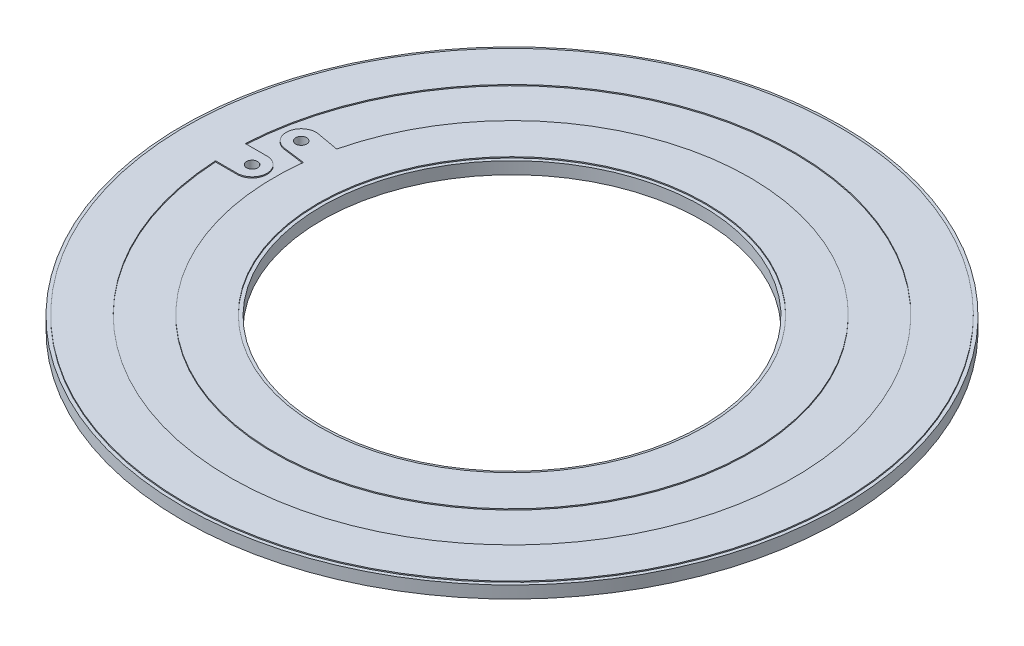
ISO-10303-21;
HEADER;
FILE_DESCRIPTION(('STEP AP214'),'2;1');
FILE_NAME('part.step','',(''),(''),'','','');
FILE_SCHEMA(('AUTOMOTIVE_DESIGN { 1 0 10303 214 1 1 1 1 }'));
ENDSEC;
DATA;
#1=APPLICATION_CONTEXT('core data for automotive mechanical design processes');
#2=APPLICATION_PROTOCOL_DEFINITION('international standard','automotive_design',2000,#1);
#3=PRODUCT_CONTEXT('',#1,'mechanical');
#4=PRODUCT('Part','Part','',(#3));
#5=PRODUCT_RELATED_PRODUCT_CATEGORY('part','',(#4));
#6=PRODUCT_DEFINITION_FORMATION('','',#4);
#7=PRODUCT_DEFINITION_CONTEXT('part definition',#1,'design');
#8=PRODUCT_DEFINITION('design','',#6,#7);
#9=PRODUCT_DEFINITION_SHAPE('','',#8);
#10=(LENGTH_UNIT() NAMED_UNIT(*) SI_UNIT(.MILLI.,.METRE.));
#11=(NAMED_UNIT(*) PLANE_ANGLE_UNIT() SI_UNIT($,.RADIAN.));
#12=(NAMED_UNIT(*) SI_UNIT($,.STERADIAN.) SOLID_ANGLE_UNIT());
#13=UNCERTAINTY_MEASURE_WITH_UNIT(LENGTH_MEASURE(1.E-05),#10,'distance_accuracy_value','');
#14=(GEOMETRIC_REPRESENTATION_CONTEXT(3) GLOBAL_UNCERTAINTY_ASSIGNED_CONTEXT((#13)) GLOBAL_UNIT_ASSIGNED_CONTEXT((#10,
#11,#12)) REPRESENTATION_CONTEXT('',''));
#15=CARTESIAN_POINT('',(0.,0.,0.));
#16=DIRECTION('',(0.,0.,1.));
#17=DIRECTION('',(1.,0.,0.));
#18=AXIS2_PLACEMENT_3D('',#15,#16,#17);
#19=CARTESIAN_POINT('',(0.,1.1,0.));
#20=DIRECTION('',(0.,1.,0.));
#21=DIRECTION('',(0.,0.,1.));
#22=AXIS2_PLACEMENT_3D('',#19,#20,#21);
#23=PLANE('',#22);
#24=CARTESIAN_POINT('',(0.,1.1,0.));
#25=DIRECTION('',(0.,1.,0.));
#26=DIRECTION('',(0.,0.,1.));
#27=AXIS2_PLACEMENT_3D('',#24,#25,#26);
#28=CIRCLE('',#27,25.5);
#29=CARTESIAN_POINT('',(-25.4644541235623,1.1,-1.34594806325903));
#30=VERTEX_POINT('',#29);
#31=CARTESIAN_POINT('',(-25.4644541235623,1.1,1.34594806325904));
#32=VERTEX_POINT('',#31);
#33=EDGE_CURVE('E12',#30,#32,#28,.F.);
#34=ORIENTED_EDGE('',*,*,#33,.F.);
#35=DIRECTION('',(-1.,0.,0.));
#36=VECTOR('',#35,1.);
#37=CARTESIAN_POINT('',(-23.5,1.1,-1.34594806325903));
#38=LINE('',#37,#36);
#39=CARTESIAN_POINT('',(-23.5,1.1,-1.34594806325903));
#40=VERTEX_POINT('',#39);
#41=EDGE_CURVE('E131',#40,#30,#38,.T.);
#42=ORIENTED_EDGE('',*,*,#41,.F.);
#43=CARTESIAN_POINT('',(-23.5,1.1,0.));
#44=DIRECTION('',(0.,1.,0.));
#45=DIRECTION('',(0.,0.,1.));
#46=AXIS2_PLACEMENT_3D('',#43,#44,#45);
#47=CIRCLE('',#46,1.34594806325904);
#48=CARTESIAN_POINT('',(-23.5,1.1,1.34594806325904));
#49=VERTEX_POINT('',#48);
#50=EDGE_CURVE('E147',#49,#40,#47,.T.);
#51=ORIENTED_EDGE('',*,*,#50,.F.);
#52=DIRECTION('',(1.,0.,0.));
#53=VECTOR('',#52,1.);
#54=CARTESIAN_POINT('',(-23.5,1.1,1.34594806325904));
#55=LINE('',#54,#53);
#56=EDGE_CURVE('E231',#32,#49,#55,.T.);
#57=ORIENTED_EDGE('',*,*,#56,.F.);
#58=EDGE_LOOP('',(#34,#42,#51,#57));
#59=FACE_BOUND('',#58,.T.);
#60=CARTESIAN_POINT('',(0.,1.1,0.));
#61=DIRECTION('',(0.,1.,0.));
#62=DIRECTION('',(0.,0.,1.));
#63=AXIS2_PLACEMENT_3D('',#60,#61,#62);
#64=CIRCLE('',#63,21.5);
#65=CARTESIAN_POINT('',(-21.3552893379837,1.1,-2.49030465826969));
#66=VERTEX_POINT('',#65);
#67=CARTESIAN_POINT('',(-20.8991983463195,1.1,-5.04712873634065));
#68=VERTEX_POINT('',#67);
#69=EDGE_CURVE('E163',#66,#68,#64,.T.);
#70=ORIENTED_EDGE('',*,*,#69,.F.);
#71=DIRECTION('',(0.991542013932121,0.,0.129786110995874));
#72=VECTOR('',#71,1.);
#73=CARTESIAN_POINT('',(-23.2663600421103,1.1,-2.74045082559459));
#74=LINE('',#73,#72);
#75=CARTESIAN_POINT('',(-23.2663600421103,1.1,-2.74045082559459));
#76=VERTEX_POINT('',#75);
#77=EDGE_CURVE('E220',#76,#66,#74,.T.);
#78=ORIENTED_EDGE('',*,*,#77,.F.);
#79=CARTESIAN_POINT('',(-23.1429821957869,1.1,-4.08073217517287));
#80=DIRECTION('',(0.,1.,0.));
#81=DIRECTION('',(-0.173648177666931,0.,0.984807753012208));
#82=AXIS2_PLACEMENT_3D('',#79,#80,#81);
#83=CIRCLE('',#82,1.34594806325904);
#84=CARTESIAN_POINT('',(-22.8005162282659,1.1,-5.38238237783128));
#85=VERTEX_POINT('',#84);
#86=EDGE_CURVE('E130',#85,#76,#83,.T.);
#87=ORIENTED_EDGE('',*,*,#86,.F.);
#88=DIRECTION('',(-0.984807753012208,0.,-0.17364817766693));
#89=VECTOR('',#88,1.);
#90=CARTESIAN_POINT('',(-22.8005162282659,1.1,-5.38238237783128));
#91=LINE('',#90,#89);
#92=EDGE_CURVE('E122',#68,#85,#91,.T.);
#93=ORIENTED_EDGE('',*,*,#92,.F.);
#94=EDGE_LOOP('',(#70,#78,#87,#93));
#95=FACE_BOUND('',#94,.T.);
#96=ADVANCED_FACE('F46',(#59,#95),#23,.T.);
#97=CARTESIAN_POINT('',(0.,1.2,0.));
#98=DIRECTION('',(0.,-1.,0.));
#99=DIRECTION('',(0.,0.,-1.));
#100=AXIS2_PLACEMENT_3D('',#97,#98,#99);
#101=CYLINDRICAL_SURFACE('',#100,21.5);
#102=DIRECTION('',(0.,-1.,0.));
#103=VECTOR('',#102,1.);
#104=CARTESIAN_POINT('',(-21.3552893379837,1.2,-2.49030465826969));
#105=LINE('',#104,#103);
#106=CARTESIAN_POINT('',(-21.3552893379837,1.2,-2.49030465826969));
#107=VERTEX_POINT('',#106);
#108=EDGE_CURVE('E116',#107,#66,#105,.T.);
#109=ORIENTED_EDGE('',*,*,#108,.T.);
#110=ORIENTED_EDGE('',*,*,#69,.T.);
#111=DIRECTION('',(0.,-1.,0.));
#112=VECTOR('',#111,1.);
#113=CARTESIAN_POINT('',(-20.8991983463195,1.2,-5.04712873634065));
#114=LINE('',#113,#112);
#115=CARTESIAN_POINT('',(-20.8991983463195,1.2,-5.04712873634065));
#116=VERTEX_POINT('',#115);
#117=EDGE_CURVE('E222',#116,#68,#114,.T.);
#118=ORIENTED_EDGE('',*,*,#117,.F.);
#119=CARTESIAN_POINT('',(0.,1.2,0.));
#120=DIRECTION('',(0.,1.,0.));
#121=DIRECTION('',(0.,0.,1.));
#122=AXIS2_PLACEMENT_3D('',#119,#120,#121);
#123=CIRCLE('',#122,21.5);
#124=EDGE_CURVE('E169',#107,#116,#123,.T.);
#125=ORIENTED_EDGE('',*,*,#124,.F.);
#126=EDGE_LOOP('',(#109,#110,#118,#125));
#127=FACE_BOUND('',#126,.T.);
#128=ADVANCED_FACE('F207',(#127),#101,.T.);
#129=CARTESIAN_POINT('',(-23.1429821957869,1.2,-4.08073217517287));
#130=DIRECTION('',(0.,-1.,0.));
#131=DIRECTION('',(0.,0.,-1.));
#132=AXIS2_PLACEMENT_3D('',#129,#130,#131);
#133=CYLINDRICAL_SURFACE('',#132,1.34594806325904);
#134=DIRECTION('',(0.,-1.,0.));
#135=VECTOR('',#134,1.);
#136=CARTESIAN_POINT('',(-23.2663600421103,1.2,-2.74045082559459));
#137=LINE('',#136,#135);
#138=CARTESIAN_POINT('',(-23.2663600421103,1.2,-2.74045082559459));
#139=VERTEX_POINT('',#138);
#140=EDGE_CURVE('E113',#139,#76,#137,.T.);
#141=ORIENTED_EDGE('',*,*,#140,.F.);
#142=CARTESIAN_POINT('',(-23.1429821957869,1.2,-4.08073217517287));
#143=DIRECTION('',(0.,1.,0.));
#144=DIRECTION('',(-0.173648177666931,0.,0.984807753012208));
#145=AXIS2_PLACEMENT_3D('',#142,#143,#144);
#146=CIRCLE('',#145,1.34594806325904);
#147=CARTESIAN_POINT('',(-22.8005162282659,1.2,-5.38238237783128));
#148=VERTEX_POINT('',#147);
#149=EDGE_CURVE('E128',#148,#139,#146,.T.);
#150=ORIENTED_EDGE('',*,*,#149,.F.);
#151=DIRECTION('',(0.,-1.,0.));
#152=VECTOR('',#151,1.);
#153=CARTESIAN_POINT('',(-22.8005162282659,1.2,-5.38238237783128));
#154=LINE('',#153,#152);
#155=EDGE_CURVE('E61',#148,#85,#154,.T.);
#156=ORIENTED_EDGE('',*,*,#155,.T.);
#157=ORIENTED_EDGE('',*,*,#86,.T.);
#158=EDGE_LOOP('',(#141,#150,#156,#157));
#159=FACE_BOUND('',#158,.T.);
#160=ADVANCED_FACE('F127',(#159),#133,.T.);
#161=CARTESIAN_POINT('',(0.,1.2,0.));
#162=DIRECTION('',(0.,-1.,0.));
#163=DIRECTION('',(0.,0.,-1.));
#164=AXIS2_PLACEMENT_3D('',#161,#162,#163);
#165=CYLINDRICAL_SURFACE('',#164,25.5);
#166=CARTESIAN_POINT('',(0.,1.2,0.));
#167=DIRECTION('',(0.,1.,0.));
#168=DIRECTION('',(0.,0.,1.));
#169=AXIS2_PLACEMENT_3D('',#166,#167,#168);
#170=CIRCLE('',#169,25.5);
#171=CARTESIAN_POINT('',(-25.4644541235623,1.2,1.34594806325904));
#172=VERTEX_POINT('',#171);
#173=CARTESIAN_POINT('',(-25.4644541235623,1.2,-1.34594806325903));
#174=VERTEX_POINT('',#173);
#175=EDGE_CURVE('E157',#172,#174,#170,.T.);
#176=ORIENTED_EDGE('',*,*,#175,.T.);
#177=DIRECTION('',(0.,-1.,0.));
#178=VECTOR('',#177,1.);
#179=CARTESIAN_POINT('',(-25.4644541235623,1.2,-1.34594806325903));
#180=LINE('',#179,#178);
#181=EDGE_CURVE('E240',#174,#30,#180,.T.);
#182=ORIENTED_EDGE('',*,*,#181,.T.);
#183=ORIENTED_EDGE('',*,*,#33,.T.);
#184=DIRECTION('',(0.,-1.,0.));
#185=VECTOR('',#184,1.);
#186=CARTESIAN_POINT('',(-25.4644541235623,1.2,1.34594806325904));
#187=LINE('',#186,#185);
#188=EDGE_CURVE('E238',#32,#172,#187,.F.);
#189=ORIENTED_EDGE('',*,*,#188,.T.);
#190=EDGE_LOOP('',(#176,#182,#183,#189));
#191=FACE_BOUND('',#190,.T.);
#192=ADVANCED_FACE('F201',(#191),#165,.F.);
#193=CARTESIAN_POINT('',(-23.5,1.2,0.));
#194=DIRECTION('',(0.,-1.,0.));
#195=DIRECTION('',(0.,0.,-1.));
#196=AXIS2_PLACEMENT_3D('',#193,#194,#195);
#197=CYLINDRICAL_SURFACE('',#196,1.34594806325904);
#198=DIRECTION('',(0.,-1.,0.));
#199=VECTOR('',#198,1.);
#200=CARTESIAN_POINT('',(-23.5,1.2,-1.34594806325903));
#201=LINE('',#200,#199);
#202=CARTESIAN_POINT('',(-23.5,1.2,-1.34594806325903));
#203=VERTEX_POINT('',#202);
#204=EDGE_CURVE('E236',#203,#40,#201,.T.);
#205=ORIENTED_EDGE('',*,*,#204,.F.);
#206=CARTESIAN_POINT('',(-23.5,1.2,0.));
#207=DIRECTION('',(0.,1.,0.));
#208=DIRECTION('',(0.,0.,1.));
#209=AXIS2_PLACEMENT_3D('',#206,#207,#208);
#210=CIRCLE('',#209,1.34594806325904);
#211=CARTESIAN_POINT('',(-23.5,1.2,1.34594806325904));
#212=VERTEX_POINT('',#211);
#213=EDGE_CURVE('E148',#212,#203,#210,.T.);
#214=ORIENTED_EDGE('',*,*,#213,.F.);
#215=DIRECTION('',(0.,-1.,0.));
#216=VECTOR('',#215,1.);
#217=CARTESIAN_POINT('',(-23.5,1.2,1.34594806325904));
#218=LINE('',#217,#216);
#219=EDGE_CURVE('E69',#212,#49,#218,.T.);
#220=ORIENTED_EDGE('',*,*,#219,.T.);
#221=ORIENTED_EDGE('',*,*,#50,.T.);
#222=EDGE_LOOP('',(#205,#214,#220,#221));
#223=FACE_BOUND('',#222,.T.);
#224=ADVANCED_FACE('F192',(#223),#197,.T.);
#225=CARTESIAN_POINT('',(0.,1.1,0.));
#226=DIRECTION('',(0.,1.,0.));
#227=DIRECTION('',(0.,0.,1.));
#228=AXIS2_PLACEMENT_3D('',#225,#226,#227);
#229=CIRCLE('',#228,17.2);
#230=CARTESIAN_POINT('',(0.,1.1,17.2));
#231=VERTEX_POINT('',#230);
#232=EDGE_CURVE('E174',#231,#231,#229,.T.);
#233=ORIENTED_EDGE('',*,*,#232,.F.);
#234=EDGE_LOOP('',(#233));
#235=FACE_BOUND('',#234,.T.);
#236=CARTESIAN_POINT('',(0.,1.1,0.));
#237=DIRECTION('',(0.,1.,0.));
#238=DIRECTION('',(0.,0.,1.));
#239=AXIS2_PLACEMENT_3D('',#236,#237,#238);
#240=CIRCLE('',#239,17.5);
#241=CARTESIAN_POINT('',(0.,1.1,17.5));
#242=VERTEX_POINT('',#241);
#243=EDGE_CURVE('E54',#242,#242,#240,.F.);
#244=ORIENTED_EDGE('',*,*,#243,.F.);
#245=EDGE_LOOP('',(#244));
#246=FACE_BOUND('',#245,.T.);
#247=ADVANCED_FACE('F189',(#235,#246),#23,.T.);
#248=CARTESIAN_POINT('',(0.,1.1,0.));
#249=DIRECTION('',(0.,1.,0.));
#250=DIRECTION('',(0.,0.,1.));
#251=AXIS2_PLACEMENT_3D('',#248,#249,#250);
#252=CIRCLE('',#251,29.5);
#253=CARTESIAN_POINT('',(0.,1.1,29.5));
#254=VERTEX_POINT('',#253);
#255=EDGE_CURVE('E156',#254,#254,#252,.T.);
#256=ORIENTED_EDGE('',*,*,#255,.F.);
#257=EDGE_LOOP('',(#256));
#258=FACE_BOUND('',#257,.T.);
#259=CARTESIAN_POINT('',(0.,1.1,0.));
#260=DIRECTION('',(0.,1.,0.));
#261=DIRECTION('',(0.,0.,1.));
#262=AXIS2_PLACEMENT_3D('',#259,#260,#261);
#263=CIRCLE('',#262,29.8);
#264=CARTESIAN_POINT('',(0.,1.1,29.8));
#265=VERTEX_POINT('',#264);
#266=EDGE_CURVE('E180',#265,#265,#263,.T.);
#267=ORIENTED_EDGE('',*,*,#266,.T.);
#268=EDGE_LOOP('',(#267));
#269=FACE_BOUND('',#268,.T.);
#270=ADVANCED_FACE('F191',(#258,#269),#23,.T.);
#271=CARTESIAN_POINT('',(0.,0.,0.));
#272=DIRECTION('',(0.,1.,0.));
#273=DIRECTION('',(0.,0.,1.));
#274=AXIS2_PLACEMENT_3D('',#271,#272,#273);
#275=PLANE('',#274);
#276=CARTESIAN_POINT('',(-23.1429821957869,0.,-4.08073217517287));
#277=DIRECTION('',(0.,1.,0.));
#278=DIRECTION('',(-0.173648177666931,0.,0.984807753012208));
#279=AXIS2_PLACEMENT_3D('',#276,#277,#278);
#280=CIRCLE('',#279,0.499999999999999);
#281=CARTESIAN_POINT('',(-23.2298062846204,0.,-3.58832829866676));
#282=VERTEX_POINT('',#281);
#283=EDGE_CURVE('E135',#282,#282,#280,.T.);
#284=ORIENTED_EDGE('',*,*,#283,.T.);
#285=EDGE_LOOP('',(#284));
#286=FACE_BOUND('',#285,.T.);
#287=CARTESIAN_POINT('',(-23.5,0.,0.));
#288=DIRECTION('',(0.,1.,0.));
#289=DIRECTION('',(0.,0.,1.));
#290=AXIS2_PLACEMENT_3D('',#287,#288,#289);
#291=CIRCLE('',#290,0.499999999999999);
#292=CARTESIAN_POINT('',(-23.5,0.,0.500000000000002));
#293=VERTEX_POINT('',#292);
#294=EDGE_CURVE('E151',#293,#293,#291,.T.);
#295=ORIENTED_EDGE('',*,*,#294,.T.);
#296=EDGE_LOOP('',(#295));
#297=FACE_BOUND('',#296,.T.);
#298=CARTESIAN_POINT('',(0.,0.,0.));
#299=DIRECTION('',(0.,1.,0.));
#300=DIRECTION('',(0.,0.,1.));
#301=AXIS2_PLACEMENT_3D('',#298,#299,#300);
#302=CIRCLE('',#301,29.8);
#303=CARTESIAN_POINT('',(0.,0.,29.8));
#304=VERTEX_POINT('',#303);
#305=EDGE_CURVE('E177',#304,#304,#302,.T.);
#306=ORIENTED_EDGE('',*,*,#305,.F.);
#307=EDGE_LOOP('',(#306));
#308=FACE_BOUND('',#307,.T.);
#309=CARTESIAN_POINT('',(0.,0.,0.));
#310=DIRECTION('',(0.,1.,0.));
#311=DIRECTION('',(0.,0.,1.));
#312=AXIS2_PLACEMENT_3D('',#309,#310,#311);
#313=CIRCLE('',#312,17.2);
#314=CARTESIAN_POINT('',(0.,0.,17.2));
#315=VERTEX_POINT('',#314);
#316=EDGE_CURVE('E171',#315,#315,#313,.T.);
#317=ORIENTED_EDGE('',*,*,#316,.T.);
#318=EDGE_LOOP('',(#317));
#319=FACE_BOUND('',#318,.T.);
#320=ADVANCED_FACE('F199',(#286,#297,#308,#319),#275,.F.);
#321=CARTESIAN_POINT('',(0.,1.1,0.));
#322=DIRECTION('',(0.,-1.,0.));
#323=DIRECTION('',(0.,0.,-1.));
#324=AXIS2_PLACEMENT_3D('',#321,#322,#323);
#325=CYLINDRICAL_SURFACE('',#324,29.8);
#326=ORIENTED_EDGE('',*,*,#266,.F.);
#327=EDGE_LOOP('',(#326));
#328=FACE_BOUND('',#327,.T.);
#329=ORIENTED_EDGE('',*,*,#305,.T.);
#330=EDGE_LOOP('',(#329));
#331=FACE_BOUND('',#330,.T.);
#332=ADVANCED_FACE('F48',(#328,#331),#325,.T.);
#333=CARTESIAN_POINT('',(0.,1.1,0.));
#334=DIRECTION('',(0.,-1.,0.));
#335=DIRECTION('',(0.,0.,-1.));
#336=AXIS2_PLACEMENT_3D('',#333,#334,#335);
#337=CYLINDRICAL_SURFACE('',#336,17.2);
#338=ORIENTED_EDGE('',*,*,#232,.T.);
#339=EDGE_LOOP('',(#338));
#340=FACE_BOUND('',#339,.T.);
#341=ORIENTED_EDGE('',*,*,#316,.F.);
#342=EDGE_LOOP('',(#341));
#343=FACE_BOUND('',#342,.T.);
#344=ADVANCED_FACE('F258',(#340,#343),#337,.F.);
#345=CARTESIAN_POINT('',(0.,1.2,0.));
#346=DIRECTION('',(0.,-1.,0.));
#347=DIRECTION('',(0.,0.,-1.));
#348=AXIS2_PLACEMENT_3D('',#345,#346,#347);
#349=CYLINDRICAL_SURFACE('',#348,17.5);
#350=CARTESIAN_POINT('',(0.,1.2,0.));
#351=DIRECTION('',(0.,1.,0.));
#352=DIRECTION('',(0.,0.,1.));
#353=AXIS2_PLACEMENT_3D('',#350,#351,#352);
#354=CIRCLE('',#353,17.5);
#355=CARTESIAN_POINT('',(0.,1.2,17.5));
#356=VERTEX_POINT('',#355);
#357=EDGE_CURVE('E166',#356,#356,#354,.T.);
#358=ORIENTED_EDGE('',*,*,#357,.T.);
#359=EDGE_LOOP('',(#358));
#360=FACE_BOUND('',#359,.T.);
#361=ORIENTED_EDGE('',*,*,#243,.T.);
#362=EDGE_LOOP('',(#361));
#363=FACE_BOUND('',#362,.T.);
#364=ADVANCED_FACE('F187',(#360,#363),#349,.F.);
#365=CARTESIAN_POINT('',(0.,1.2,0.));
#366=DIRECTION('',(0.,1.,0.));
#367=DIRECTION('',(0.,0.,1.));
#368=AXIS2_PLACEMENT_3D('',#365,#366,#367);
#369=PLANE('',#368);
#370=ORIENTED_EDGE('',*,*,#357,.F.);
#371=EDGE_LOOP('',(#370));
#372=FACE_BOUND('',#371,.T.);
#373=ORIENTED_EDGE('',*,*,#124,.T.);
#374=DIRECTION('',(-0.984807753012208,0.,-0.17364817766693));
#375=VECTOR('',#374,1.);
#376=CARTESIAN_POINT('',(-22.8005162282659,1.2,-5.38238237783128));
#377=LINE('',#376,#375);
#378=EDGE_CURVE('E121',#116,#148,#377,.T.);
#379=ORIENTED_EDGE('',*,*,#378,.T.);
#380=ORIENTED_EDGE('',*,*,#149,.T.);
#381=DIRECTION('',(0.991542013932121,0.,0.129786110995874));
#382=VECTOR('',#381,1.);
#383=CARTESIAN_POINT('',(-23.2663600421103,1.2,-2.74045082559459));
#384=LINE('',#383,#382);
#385=EDGE_CURVE('E110',#139,#107,#384,.T.);
#386=ORIENTED_EDGE('',*,*,#385,.T.);
#387=EDGE_LOOP('',(#373,#379,#380,#386));
#388=FACE_BOUND('',#387,.T.);
#389=CARTESIAN_POINT('',(-23.1429821957869,1.2,-4.08073217517287));
#390=DIRECTION('',(0.,1.,0.));
#391=DIRECTION('',(-0.173648177666931,0.,0.984807753012208));
#392=AXIS2_PLACEMENT_3D('',#389,#390,#391);
#393=CIRCLE('',#392,0.499999999999999);
#394=CARTESIAN_POINT('',(-23.2298062846204,1.2,-3.58832829866676));
#395=VERTEX_POINT('',#394);
#396=EDGE_CURVE('E140',#395,#395,#393,.T.);
#397=ORIENTED_EDGE('',*,*,#396,.F.);
#398=EDGE_LOOP('',(#397));
#399=FACE_BOUND('',#398,.T.);
#400=ADVANCED_FACE('F133',(#372,#388,#399),#369,.T.);
#401=CARTESIAN_POINT('',(0.,1.2,0.));
#402=DIRECTION('',(0.,-1.,0.));
#403=DIRECTION('',(0.,0.,-1.));
#404=AXIS2_PLACEMENT_3D('',#401,#402,#403);
#405=CYLINDRICAL_SURFACE('',#404,29.5);
#406=CARTESIAN_POINT('',(0.,1.2,0.));
#407=DIRECTION('',(0.,1.,0.));
#408=DIRECTION('',(0.,0.,1.));
#409=AXIS2_PLACEMENT_3D('',#406,#407,#408);
#410=CIRCLE('',#409,29.5);
#411=CARTESIAN_POINT('',(0.,1.2,29.5));
#412=VERTEX_POINT('',#411);
#413=EDGE_CURVE('E160',#412,#412,#410,.T.);
#414=ORIENTED_EDGE('',*,*,#413,.F.);
#415=EDGE_LOOP('',(#414));
#416=FACE_BOUND('',#415,.T.);
#417=ORIENTED_EDGE('',*,*,#255,.T.);
#418=EDGE_LOOP('',(#417));
#419=FACE_BOUND('',#418,.T.);
#420=ADVANCED_FACE('F248',(#416,#419),#405,.T.);
#421=CARTESIAN_POINT('',(0.,1.2,0.));
#422=DIRECTION('',(0.,1.,0.));
#423=DIRECTION('',(0.,0.,1.));
#424=AXIS2_PLACEMENT_3D('',#421,#422,#423);
#425=PLANE('',#424);
#426=ORIENTED_EDGE('',*,*,#175,.F.);
#427=DIRECTION('',(1.,0.,0.));
#428=VECTOR('',#427,1.);
#429=CARTESIAN_POINT('',(-23.5,1.2,1.34594806325904));
#430=LINE('',#429,#428);
#431=EDGE_CURVE('E230',#172,#212,#430,.T.);
#432=ORIENTED_EDGE('',*,*,#431,.T.);
#433=ORIENTED_EDGE('',*,*,#213,.T.);
#434=DIRECTION('',(-1.,0.,0.));
#435=VECTOR('',#434,1.);
#436=CARTESIAN_POINT('',(-23.5,1.2,-1.34594806325903));
#437=LINE('',#436,#435);
#438=EDGE_CURVE('E227',#203,#174,#437,.T.);
#439=ORIENTED_EDGE('',*,*,#438,.T.);
#440=EDGE_LOOP('',(#426,#432,#433,#439));
#441=FACE_BOUND('',#440,.T.);
#442=ORIENTED_EDGE('',*,*,#413,.T.);
#443=EDGE_LOOP('',(#442));
#444=FACE_BOUND('',#443,.T.);
#445=CARTESIAN_POINT('',(-23.5,1.2,0.));
#446=DIRECTION('',(0.,1.,0.));
#447=DIRECTION('',(0.,0.,1.));
#448=AXIS2_PLACEMENT_3D('',#445,#446,#447);
#449=CIRCLE('',#448,0.499999999999999);
#450=CARTESIAN_POINT('',(-23.5,1.2,0.500000000000002));
#451=VERTEX_POINT('',#450);
#452=EDGE_CURVE('E138',#451,#451,#449,.T.);
#453=ORIENTED_EDGE('',*,*,#452,.F.);
#454=EDGE_LOOP('',(#453));
#455=FACE_BOUND('',#454,.T.);
#456=ADVANCED_FACE('F255',(#441,#444,#455),#425,.T.);
#457=CARTESIAN_POINT('',(-23.5,0.,0.));
#458=DIRECTION('',(0.,1.,0.));
#459=DIRECTION('',(0.,0.,1.));
#460=AXIS2_PLACEMENT_3D('',#457,#458,#459);
#461=CYLINDRICAL_SURFACE('',#460,0.499999999999999);
#462=ORIENTED_EDGE('',*,*,#294,.F.);
#463=EDGE_LOOP('',(#462));
#464=FACE_BOUND('',#463,.T.);
#465=ORIENTED_EDGE('',*,*,#452,.T.);
#466=EDGE_LOOP('',(#465));
#467=FACE_BOUND('',#466,.T.);
#468=ADVANCED_FACE('F283',(#464,#467),#461,.F.);
#469=CARTESIAN_POINT('',(-23.1429821957869,0.,-4.08073217517287));
#470=DIRECTION('',(0.,1.,0.));
#471=DIRECTION('',(0.,0.,1.));
#472=AXIS2_PLACEMENT_3D('',#469,#470,#471);
#473=CYLINDRICAL_SURFACE('',#472,0.499999999999999);
#474=ORIENTED_EDGE('',*,*,#283,.F.);
#475=EDGE_LOOP('',(#474));
#476=FACE_BOUND('',#475,.T.);
#477=ORIENTED_EDGE('',*,*,#396,.T.);
#478=EDGE_LOOP('',(#477));
#479=FACE_BOUND('',#478,.T.);
#480=ADVANCED_FACE('F246',(#476,#479),#473,.F.);
#481=CARTESIAN_POINT('',(-23.5,1.2,-1.34594806325903));
#482=DIRECTION('',(0.,0.,1.));
#483=DIRECTION('',(1.,0.,0.));
#484=AXIS2_PLACEMENT_3D('',#481,#482,#483);
#485=PLANE('',#484);
#486=ORIENTED_EDGE('',*,*,#181,.F.);
#487=ORIENTED_EDGE('',*,*,#438,.F.);
#488=ORIENTED_EDGE('',*,*,#204,.T.);
#489=ORIENTED_EDGE('',*,*,#41,.T.);
#490=EDGE_LOOP('',(#486,#487,#488,#489));
#491=FACE_BOUND('',#490,.T.);
#492=ADVANCED_FACE('F299',(#491),#485,.F.);
#493=CARTESIAN_POINT('',(-23.5,1.2,1.34594806325904));
#494=DIRECTION('',(0.,0.,-1.));
#495=DIRECTION('',(-1.,0.,0.));
#496=AXIS2_PLACEMENT_3D('',#493,#494,#495);
#497=PLANE('',#496);
#498=ORIENTED_EDGE('',*,*,#188,.F.);
#499=ORIENTED_EDGE('',*,*,#56,.T.);
#500=ORIENTED_EDGE('',*,*,#219,.F.);
#501=ORIENTED_EDGE('',*,*,#431,.F.);
#502=EDGE_LOOP('',(#498,#499,#500,#501));
#503=FACE_BOUND('',#502,.T.);
#504=ADVANCED_FACE('F305',(#503),#497,.F.);
#505=CARTESIAN_POINT('',(-23.2663600421103,1.2,-2.74045082559459));
#506=DIRECTION('',(0.129786110995874,0.,-0.991542013932121));
#507=DIRECTION('',(-0.991542013932121,0.,-0.129786110995874));
#508=AXIS2_PLACEMENT_3D('',#505,#506,#507);
#509=PLANE('',#508);
#510=ORIENTED_EDGE('',*,*,#77,.T.);
#511=ORIENTED_EDGE('',*,*,#108,.F.);
#512=ORIENTED_EDGE('',*,*,#385,.F.);
#513=ORIENTED_EDGE('',*,*,#140,.T.);
#514=EDGE_LOOP('',(#510,#511,#512,#513));
#515=FACE_BOUND('',#514,.T.);
#516=ADVANCED_FACE('F112',(#515),#509,.F.);
#517=CARTESIAN_POINT('',(-22.8005162282659,1.2,-5.38238237783128));
#518=DIRECTION('',(-0.17364817766693,0.,0.984807753012208));
#519=DIRECTION('',(0.984807753012208,0.,0.17364817766693));
#520=AXIS2_PLACEMENT_3D('',#517,#518,#519);
#521=PLANE('',#520);
#522=ORIENTED_EDGE('',*,*,#92,.T.);
#523=ORIENTED_EDGE('',*,*,#155,.F.);
#524=ORIENTED_EDGE('',*,*,#378,.F.);
#525=ORIENTED_EDGE('',*,*,#117,.T.);
#526=EDGE_LOOP('',(#522,#523,#524,#525));
#527=FACE_BOUND('',#526,.T.);
#528=ADVANCED_FACE('F311',(#527),#521,.F.);
#529=CLOSED_SHELL('',(#96,#128,#160,#192,#224,#247,#270,#320,#332,#344,#364,#400,#420,#456,#468,
#480,#492,#504,#516,#528));
#530=MANIFOLD_SOLID_BREP('B2',#529);
#531=ADVANCED_BREP_SHAPE_REPRESENTATION('',(#18,#530),#14);
#532=SHAPE_DEFINITION_REPRESENTATION(#9,#531);
ENDSEC;
END-ISO-10303-21;
